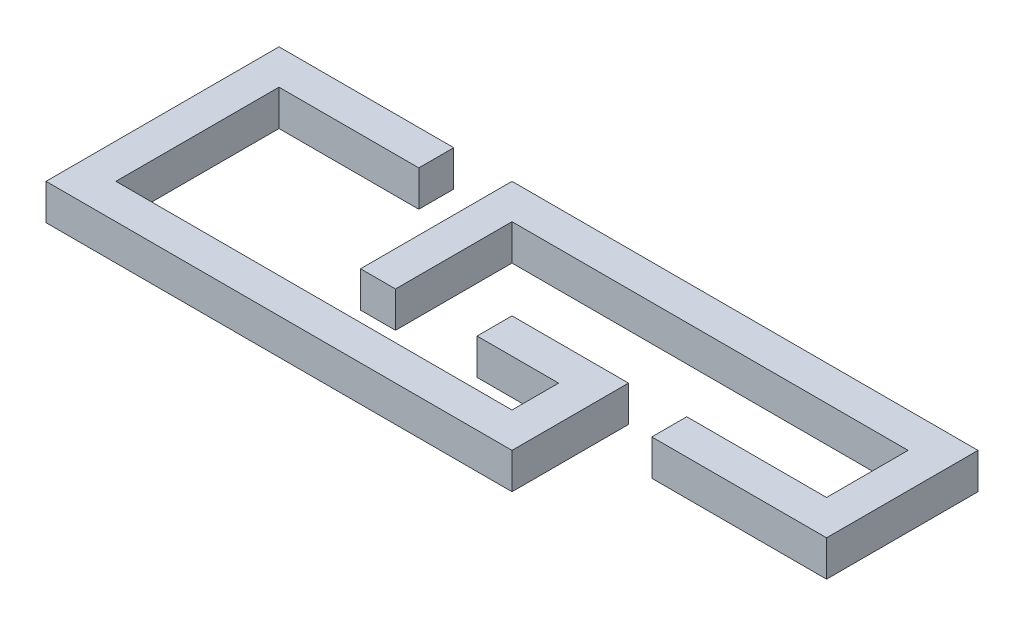
ISO-10303-21;
HEADER;
FILE_DESCRIPTION(('STEP AP214'),'2;1');
FILE_NAME('part.step','',(''),(''),'','','');
FILE_SCHEMA(('AUTOMOTIVE_DESIGN { 1 0 10303 214 1 1 1 1 }'));
ENDSEC;
DATA;
#1=APPLICATION_CONTEXT('core data for automotive mechanical design processes');
#2=APPLICATION_PROTOCOL_DEFINITION('international standard','automotive_design',2000,#1);
#3=PRODUCT_CONTEXT('',#1,'mechanical');
#4=PRODUCT('Part','Part','',(#3));
#5=PRODUCT_RELATED_PRODUCT_CATEGORY('part','',(#4));
#6=PRODUCT_DEFINITION_FORMATION('','',#4);
#7=PRODUCT_DEFINITION_CONTEXT('part definition',#1,'design');
#8=PRODUCT_DEFINITION('design','',#6,#7);
#9=PRODUCT_DEFINITION_SHAPE('','',#8);
#10=(LENGTH_UNIT() NAMED_UNIT(*) SI_UNIT(.MILLI.,.METRE.));
#11=(NAMED_UNIT(*) PLANE_ANGLE_UNIT() SI_UNIT($,.RADIAN.));
#12=(NAMED_UNIT(*) SI_UNIT($,.STERADIAN.) SOLID_ANGLE_UNIT());
#13=UNCERTAINTY_MEASURE_WITH_UNIT(LENGTH_MEASURE(1.E-05),#10,'distance_accuracy_value','');
#14=(GEOMETRIC_REPRESENTATION_CONTEXT(3) GLOBAL_UNCERTAINTY_ASSIGNED_CONTEXT((#13)) GLOBAL_UNIT_ASSIGNED_CONTEXT((#10,
#11,#12)) REPRESENTATION_CONTEXT('',''));
#15=CARTESIAN_POINT('',(0.,0.,0.));
#16=DIRECTION('',(0.,0.,1.));
#17=DIRECTION('',(1.,0.,0.));
#18=AXIS2_PLACEMENT_3D('',#15,#16,#17);
#19=CARTESIAN_POINT('',(-9.74999999999981,2.,-8.45000000000092));
#20=DIRECTION('',(0.,0.,1.));
#21=DIRECTION('',(1.,0.,0.));
#22=AXIS2_PLACEMENT_3D('',#19,#20,#21);
#23=PLANE('',#22);
#24=DIRECTION('',(-1.,0.,0.));
#25=VECTOR('',#24,1.);
#26=CARTESIAN_POINT('',(-9.74999999999981,0.,-8.45000000000092));
#27=LINE('',#26,#25);
#28=CARTESIAN_POINT('',(-9.74999999999981,0.,-8.45000000000092));
#29=VERTEX_POINT('',#28);
#30=CARTESIAN_POINT('',(-19.5000000000001,0.,-8.45000000000092));
#31=VERTEX_POINT('',#30);
#32=EDGE_CURVE('E163',#29,#31,#27,.T.);
#33=ORIENTED_EDGE('',*,*,#32,.T.);
#34=DIRECTION('',(0.,-1.,0.));
#35=VECTOR('',#34,1.);
#36=CARTESIAN_POINT('',(-19.5000000000001,2.,-8.45000000000092));
#37=LINE('',#36,#35);
#38=CARTESIAN_POINT('',(-19.5000000000001,2.,-8.45000000000092));
#39=VERTEX_POINT('',#38);
#40=EDGE_CURVE('E12',#39,#31,#37,.T.);
#41=ORIENTED_EDGE('',*,*,#40,.F.);
#42=DIRECTION('',(-1.,0.,0.));
#43=VECTOR('',#42,1.);
#44=CARTESIAN_POINT('',(-9.74999999999981,2.,-8.45000000000092));
#45=LINE('',#44,#43);
#46=CARTESIAN_POINT('',(-9.74999999999981,2.,-8.45000000000092));
#47=VERTEX_POINT('',#46);
#48=EDGE_CURVE('E185',#47,#39,#45,.T.);
#49=ORIENTED_EDGE('',*,*,#48,.F.);
#50=DIRECTION('',(0.,-1.,0.));
#51=VECTOR('',#50,1.);
#52=CARTESIAN_POINT('',(-9.74999999999981,2.,-8.45000000000092));
#53=LINE('',#52,#51);
#54=EDGE_CURVE('E159',#47,#29,#53,.T.);
#55=ORIENTED_EDGE('',*,*,#54,.T.);
#56=EDGE_LOOP('',(#33,#41,#49,#55));
#57=FACE_BOUND('',#56,.T.);
#58=ADVANCED_FACE('F43',(#57),#23,.F.);
#59=CARTESIAN_POINT('',(-19.5000000000001,2.,-8.45000000000092));
#60=DIRECTION('',(1.,0.,0.));
#61=DIRECTION('',(0.,0.,-1.));
#62=AXIS2_PLACEMENT_3D('',#59,#60,#61);
#63=PLANE('',#62);
#64=DIRECTION('',(0.,0.,1.));
#65=VECTOR('',#64,1.);
#66=CARTESIAN_POINT('',(-19.5000000000001,0.,-8.45000000000092));
#67=LINE('',#66,#65);
#68=CARTESIAN_POINT('',(-19.4999999999999,0.,4.55000000000027));
#69=VERTEX_POINT('',#68);
#70=EDGE_CURVE('E166',#31,#69,#67,.T.);
#71=ORIENTED_EDGE('',*,*,#70,.T.);
#72=DIRECTION('',(0.,-1.,0.));
#73=VECTOR('',#72,1.);
#74=CARTESIAN_POINT('',(-19.4999999999999,2.,4.55000000000027));
#75=LINE('',#74,#73);
#76=CARTESIAN_POINT('',(-19.4999999999999,2.,4.55000000000027));
#77=VERTEX_POINT('',#76);
#78=EDGE_CURVE('E51',#77,#69,#75,.T.);
#79=ORIENTED_EDGE('',*,*,#78,.F.);
#80=DIRECTION('',(0.,0.,1.));
#81=VECTOR('',#80,1.);
#82=CARTESIAN_POINT('',(-19.5000000000001,2.,-8.45000000000092));
#83=LINE('',#82,#81);
#84=EDGE_CURVE('E114',#39,#77,#83,.T.);
#85=ORIENTED_EDGE('',*,*,#84,.F.);
#86=ORIENTED_EDGE('',*,*,#40,.T.);
#87=EDGE_LOOP('',(#71,#79,#85,#86));
#88=FACE_BOUND('',#87,.T.);
#89=ADVANCED_FACE('F263',(#88),#63,.F.);
#90=CARTESIAN_POINT('',(-19.4999999999999,2.,4.55000000000027));
#91=DIRECTION('',(0.,0.,-1.));
#92=DIRECTION('',(-1.,0.,0.));
#93=AXIS2_PLACEMENT_3D('',#90,#91,#92);
#94=PLANE('',#93);
#95=DIRECTION('',(1.,0.,0.));
#96=VECTOR('',#95,1.);
#97=CARTESIAN_POINT('',(-19.4999999999999,0.,4.55000000000027));
#98=LINE('',#97,#96);
#99=CARTESIAN_POINT('',(6.50000000000007,0.,4.55000000000027));
#100=VERTEX_POINT('',#99);
#101=EDGE_CURVE('E168',#69,#100,#98,.T.);
#102=ORIENTED_EDGE('',*,*,#101,.T.);
#103=DIRECTION('',(0.,-1.,0.));
#104=VECTOR('',#103,1.);
#105=CARTESIAN_POINT('',(6.50000000000007,2.,4.55000000000027));
#106=LINE('',#105,#104);
#107=CARTESIAN_POINT('',(6.50000000000007,2.,4.55000000000027));
#108=VERTEX_POINT('',#107);
#109=EDGE_CURVE('E204',#108,#100,#106,.T.);
#110=ORIENTED_EDGE('',*,*,#109,.F.);
#111=DIRECTION('',(1.,0.,0.));
#112=VECTOR('',#111,1.);
#113=CARTESIAN_POINT('',(-19.4999999999999,2.,4.55000000000027));
#114=LINE('',#113,#112);
#115=EDGE_CURVE('E212',#77,#108,#114,.T.);
#116=ORIENTED_EDGE('',*,*,#115,.F.);
#117=ORIENTED_EDGE('',*,*,#78,.T.);
#118=EDGE_LOOP('',(#102,#110,#116,#117));
#119=FACE_BOUND('',#118,.T.);
#120=ADVANCED_FACE('F210',(#119),#94,.F.);
#121=CARTESIAN_POINT('',(6.50000000000007,2.,4.55000000000027));
#122=DIRECTION('',(-1.,0.,0.));
#123=DIRECTION('',(0.,0.,1.));
#124=AXIS2_PLACEMENT_3D('',#121,#122,#123);
#125=PLANE('',#124);
#126=DIRECTION('',(0.,0.,-1.));
#127=VECTOR('',#126,1.);
#128=CARTESIAN_POINT('',(6.50000000000007,0.,4.55000000000027));
#129=LINE('',#128,#127);
#130=CARTESIAN_POINT('',(6.50000000000007,0.,-1.94999999999952));
#131=VERTEX_POINT('',#130);
#132=EDGE_CURVE('E170',#100,#131,#129,.T.);
#133=ORIENTED_EDGE('',*,*,#132,.T.);
#134=DIRECTION('',(0.,-1.,0.));
#135=VECTOR('',#134,1.);
#136=CARTESIAN_POINT('',(6.50000000000007,2.,-1.94999999999952));
#137=LINE('',#136,#135);
#138=CARTESIAN_POINT('',(6.50000000000007,2.,-1.94999999999952));
#139=VERTEX_POINT('',#138);
#140=EDGE_CURVE('E201',#139,#131,#137,.T.);
#141=ORIENTED_EDGE('',*,*,#140,.F.);
#142=DIRECTION('',(0.,0.,-1.));
#143=VECTOR('',#142,1.);
#144=CARTESIAN_POINT('',(6.50000000000007,2.,4.55000000000027));
#145=LINE('',#144,#143);
#146=EDGE_CURVE('E230',#108,#139,#145,.T.);
#147=ORIENTED_EDGE('',*,*,#146,.F.);
#148=ORIENTED_EDGE('',*,*,#109,.T.);
#149=EDGE_LOOP('',(#133,#141,#147,#148));
#150=FACE_BOUND('',#149,.T.);
#151=ADVANCED_FACE('F221',(#150),#125,.F.);
#152=CARTESIAN_POINT('',(6.50000000000007,2.,-1.94999999999952));
#153=DIRECTION('',(0.,0.,1.));
#154=DIRECTION('',(1.,0.,0.));
#155=AXIS2_PLACEMENT_3D('',#152,#153,#154);
#156=PLANE('',#155);
#157=DIRECTION('',(-1.,0.,0.));
#158=VECTOR('',#157,1.);
#159=CARTESIAN_POINT('',(6.50000000000007,0.,-1.94999999999952));
#160=LINE('',#159,#158);
#161=CARTESIAN_POINT('',(0.,0.,-1.94999999999952));
#162=VERTEX_POINT('',#161);
#163=EDGE_CURVE('E172',#131,#162,#160,.T.);
#164=ORIENTED_EDGE('',*,*,#163,.T.);
#165=DIRECTION('',(0.,-1.,0.));
#166=VECTOR('',#165,1.);
#167=CARTESIAN_POINT('',(0.,2.,-1.94999999999952));
#168=LINE('',#167,#166);
#169=CARTESIAN_POINT('',(0.,2.,-1.94999999999952));
#170=VERTEX_POINT('',#169);
#171=EDGE_CURVE('E198',#170,#162,#168,.T.);
#172=ORIENTED_EDGE('',*,*,#171,.F.);
#173=DIRECTION('',(-1.,0.,0.));
#174=VECTOR('',#173,1.);
#175=CARTESIAN_POINT('',(6.50000000000007,2.,-1.94999999999952));
#176=LINE('',#175,#174);
#177=EDGE_CURVE('E227',#139,#170,#176,.T.);
#178=ORIENTED_EDGE('',*,*,#177,.F.);
#179=ORIENTED_EDGE('',*,*,#140,.T.);
#180=EDGE_LOOP('',(#164,#172,#178,#179));
#181=FACE_BOUND('',#180,.T.);
#182=ADVANCED_FACE('F225',(#181),#156,.F.);
#183=CARTESIAN_POINT('',(0.,2.,-1.94999999999952));
#184=DIRECTION('',(1.,0.,0.));
#185=DIRECTION('',(0.,0.,-1.));
#186=AXIS2_PLACEMENT_3D('',#183,#184,#185);
#187=PLANE('',#186);
#188=DIRECTION('',(0.,0.,1.));
#189=VECTOR('',#188,1.);
#190=CARTESIAN_POINT('',(0.,0.,-1.94999999999952));
#191=LINE('',#190,#189);
#192=CARTESIAN_POINT('',(0.,0.,0.));
#193=VERTEX_POINT('',#192);
#194=EDGE_CURVE('E174',#162,#193,#191,.T.);
#195=ORIENTED_EDGE('',*,*,#194,.T.);
#196=DIRECTION('',(0.,-1.,0.));
#197=VECTOR('',#196,1.);
#198=CARTESIAN_POINT('',(0.,2.,0.));
#199=LINE('',#198,#197);
#200=CARTESIAN_POINT('',(0.,2.,0.));
#201=VERTEX_POINT('',#200);
#202=EDGE_CURVE('E195',#201,#193,#199,.T.);
#203=ORIENTED_EDGE('',*,*,#202,.F.);
#204=DIRECTION('',(0.,0.,1.));
#205=VECTOR('',#204,1.);
#206=CARTESIAN_POINT('',(0.,2.,-1.94999999999952));
#207=LINE('',#206,#205);
#208=EDGE_CURVE('E229',#170,#201,#207,.T.);
#209=ORIENTED_EDGE('',*,*,#208,.F.);
#210=ORIENTED_EDGE('',*,*,#171,.T.);
#211=EDGE_LOOP('',(#195,#203,#209,#210));
#212=FACE_BOUND('',#211,.T.);
#213=ADVANCED_FACE('F276',(#212),#187,.F.);
#214=CARTESIAN_POINT('',(0.,2.,0.));
#215=DIRECTION('',(0.,0.,-1.));
#216=DIRECTION('',(-1.,0.,0.));
#217=AXIS2_PLACEMENT_3D('',#214,#215,#216);
#218=PLANE('',#217);
#219=DIRECTION('',(1.,0.,0.));
#220=VECTOR('',#219,1.);
#221=CARTESIAN_POINT('',(0.,0.,0.));
#222=LINE('',#221,#220);
#223=CARTESIAN_POINT('',(4.55000000000004,0.,2.40579105544886E-13));
#224=VERTEX_POINT('',#223);
#225=EDGE_CURVE('E176',#193,#224,#222,.T.);
#226=ORIENTED_EDGE('',*,*,#225,.T.);
#227=DIRECTION('',(0.,-1.,0.));
#228=VECTOR('',#227,1.);
#229=CARTESIAN_POINT('',(4.55000000000004,2.,2.40579105544886E-13));
#230=LINE('',#229,#228);
#231=CARTESIAN_POINT('',(4.55000000000004,2.,2.40579105544886E-13));
#232=VERTEX_POINT('',#231);
#233=EDGE_CURVE('E192',#232,#224,#230,.T.);
#234=ORIENTED_EDGE('',*,*,#233,.F.);
#235=DIRECTION('',(1.,0.,0.));
#236=VECTOR('',#235,1.);
#237=CARTESIAN_POINT('',(0.,2.,0.));
#238=LINE('',#237,#236);
#239=EDGE_CURVE('E232',#201,#232,#238,.T.);
#240=ORIENTED_EDGE('',*,*,#239,.F.);
#241=ORIENTED_EDGE('',*,*,#202,.T.);
#242=EDGE_LOOP('',(#226,#234,#240,#241));
#243=FACE_BOUND('',#242,.T.);
#244=ADVANCED_FACE('F279',(#243),#218,.F.);
#245=CARTESIAN_POINT('',(4.55000000000004,2.,2.40579105544886E-13));
#246=DIRECTION('',(1.,0.,0.));
#247=DIRECTION('',(0.,0.,-1.));
#248=AXIS2_PLACEMENT_3D('',#245,#246,#247);
#249=PLANE('',#248);
#250=DIRECTION('',(0.,0.,1.));
#251=VECTOR('',#250,1.);
#252=CARTESIAN_POINT('',(4.55000000000004,0.,2.40579105544886E-13));
#253=LINE('',#252,#251);
#254=CARTESIAN_POINT('',(4.55000000000004,0.,2.60000000000024));
#255=VERTEX_POINT('',#254);
#256=EDGE_CURVE('E178',#224,#255,#253,.T.);
#257=ORIENTED_EDGE('',*,*,#256,.T.);
#258=DIRECTION('',(0.,-1.,0.));
#259=VECTOR('',#258,1.);
#260=CARTESIAN_POINT('',(4.55000000000004,2.,2.60000000000024));
#261=LINE('',#260,#259);
#262=CARTESIAN_POINT('',(4.55000000000004,2.,2.60000000000024));
#263=VERTEX_POINT('',#262);
#264=EDGE_CURVE('E189',#263,#255,#261,.T.);
#265=ORIENTED_EDGE('',*,*,#264,.F.);
#266=DIRECTION('',(0.,0.,1.));
#267=VECTOR('',#266,1.);
#268=CARTESIAN_POINT('',(4.55000000000004,2.,2.40579105544886E-13));
#269=LINE('',#268,#267);
#270=EDGE_CURVE('E238',#232,#263,#269,.T.);
#271=ORIENTED_EDGE('',*,*,#270,.F.);
#272=ORIENTED_EDGE('',*,*,#233,.T.);
#273=EDGE_LOOP('',(#257,#265,#271,#272));
#274=FACE_BOUND('',#273,.T.);
#275=ADVANCED_FACE('F244',(#274),#249,.F.);
#276=CARTESIAN_POINT('',(4.55000000000004,2.,2.60000000000024));
#277=DIRECTION('',(0.,0.,1.));
#278=DIRECTION('',(1.,0.,0.));
#279=AXIS2_PLACEMENT_3D('',#276,#277,#278);
#280=PLANE('',#279);
#281=DIRECTION('',(-1.,0.,0.));
#282=VECTOR('',#281,1.);
#283=CARTESIAN_POINT('',(4.55000000000004,0.,2.60000000000024));
#284=LINE('',#283,#282);
#285=CARTESIAN_POINT('',(-17.55,0.,2.60000000000024));
#286=VERTEX_POINT('',#285);
#287=EDGE_CURVE('E180',#255,#286,#284,.T.);
#288=ORIENTED_EDGE('',*,*,#287,.T.);
#289=DIRECTION('',(0.,-1.,0.));
#290=VECTOR('',#289,1.);
#291=CARTESIAN_POINT('',(-17.55,2.,2.60000000000024));
#292=LINE('',#291,#290);
#293=CARTESIAN_POINT('',(-17.55,2.,2.60000000000024));
#294=VERTEX_POINT('',#293);
#295=EDGE_CURVE('E154',#294,#286,#292,.T.);
#296=ORIENTED_EDGE('',*,*,#295,.F.);
#297=DIRECTION('',(-1.,0.,0.));
#298=VECTOR('',#297,1.);
#299=CARTESIAN_POINT('',(4.55000000000004,2.,2.60000000000024));
#300=LINE('',#299,#298);
#301=EDGE_CURVE('E145',#263,#294,#300,.T.);
#302=ORIENTED_EDGE('',*,*,#301,.F.);
#303=ORIENTED_EDGE('',*,*,#264,.T.);
#304=EDGE_LOOP('',(#288,#296,#302,#303));
#305=FACE_BOUND('',#304,.T.);
#306=ADVANCED_FACE('F248',(#305),#280,.F.);
#307=CARTESIAN_POINT('',(-17.55,2.,2.60000000000024));
#308=DIRECTION('',(-1.,0.,0.));
#309=DIRECTION('',(0.,0.,1.));
#310=AXIS2_PLACEMENT_3D('',#307,#308,#309);
#311=PLANE('',#310);
#312=DIRECTION('',(0.,0.,-1.));
#313=VECTOR('',#312,1.);
#314=CARTESIAN_POINT('',(-17.55,0.,2.60000000000024));
#315=LINE('',#314,#313);
#316=CARTESIAN_POINT('',(-17.55,0.,-6.50000000000068));
#317=VERTEX_POINT('',#316);
#318=EDGE_CURVE('E153',#286,#317,#315,.T.);
#319=ORIENTED_EDGE('',*,*,#318,.T.);
#320=DIRECTION('',(0.,-1.,0.));
#321=VECTOR('',#320,1.);
#322=CARTESIAN_POINT('',(-17.55,2.,-6.50000000000068));
#323=LINE('',#322,#321);
#324=CARTESIAN_POINT('',(-17.55,2.,-6.50000000000068));
#325=VERTEX_POINT('',#324);
#326=EDGE_CURVE('E150',#325,#317,#323,.T.);
#327=ORIENTED_EDGE('',*,*,#326,.F.);
#328=DIRECTION('',(0.,0.,-1.));
#329=VECTOR('',#328,1.);
#330=CARTESIAN_POINT('',(-17.55,2.,2.60000000000024));
#331=LINE('',#330,#329);
#332=EDGE_CURVE('E139',#294,#325,#331,.T.);
#333=ORIENTED_EDGE('',*,*,#332,.F.);
#334=ORIENTED_EDGE('',*,*,#295,.T.);
#335=EDGE_LOOP('',(#319,#327,#333,#334));
#336=FACE_BOUND('',#335,.T.);
#337=ADVANCED_FACE('F151',(#336),#311,.F.);
#338=CARTESIAN_POINT('',(-17.55,2.,-6.50000000000068));
#339=DIRECTION('',(0.,0.,-1.));
#340=DIRECTION('',(-1.,0.,0.));
#341=AXIS2_PLACEMENT_3D('',#338,#339,#340);
#342=PLANE('',#341);
#343=DIRECTION('',(1.,0.,0.));
#344=VECTOR('',#343,1.);
#345=CARTESIAN_POINT('',(-17.55,0.,-6.50000000000068));
#346=LINE('',#345,#344);
#347=CARTESIAN_POINT('',(-9.74999999999981,0.,-6.5000000000006));
#348=VERTEX_POINT('',#347);
#349=EDGE_CURVE('E100',#317,#348,#346,.T.);
#350=ORIENTED_EDGE('',*,*,#349,.T.);
#351=DIRECTION('',(0.,-1.,0.));
#352=VECTOR('',#351,1.);
#353=CARTESIAN_POINT('',(-9.74999999999981,2.,-6.5000000000006));
#354=LINE('',#353,#352);
#355=CARTESIAN_POINT('',(-9.74999999999981,2.,-6.5000000000006));
#356=VERTEX_POINT('',#355);
#357=EDGE_CURVE('E155',#356,#348,#354,.T.);
#358=ORIENTED_EDGE('',*,*,#357,.F.);
#359=DIRECTION('',(1.,0.,0.));
#360=VECTOR('',#359,1.);
#361=CARTESIAN_POINT('',(-17.55,2.,-6.50000000000068));
#362=LINE('',#361,#360);
#363=EDGE_CURVE('E143',#325,#356,#362,.T.);
#364=ORIENTED_EDGE('',*,*,#363,.F.);
#365=ORIENTED_EDGE('',*,*,#326,.T.);
#366=EDGE_LOOP('',(#350,#358,#364,#365));
#367=FACE_BOUND('',#366,.T.);
#368=ADVANCED_FACE('F157',(#367),#342,.F.);
#369=CARTESIAN_POINT('',(-9.74999999999981,2.,-6.5000000000006));
#370=DIRECTION('',(-1.,0.,0.));
#371=DIRECTION('',(0.,0.,1.));
#372=AXIS2_PLACEMENT_3D('',#369,#370,#371);
#373=PLANE('',#372);
#374=DIRECTION('',(0.,0.,-1.));
#375=VECTOR('',#374,1.);
#376=CARTESIAN_POINT('',(-9.74999999999981,0.,-6.5000000000006));
#377=LINE('',#376,#375);
#378=EDGE_CURVE('E106',#348,#29,#377,.T.);
#379=ORIENTED_EDGE('',*,*,#378,.T.);
#380=ORIENTED_EDGE('',*,*,#54,.F.);
#381=DIRECTION('',(0.,0.,-1.));
#382=VECTOR('',#381,1.);
#383=CARTESIAN_POINT('',(-9.74999999999981,2.,-6.5000000000006));
#384=LINE('',#383,#382);
#385=EDGE_CURVE('E59',#356,#47,#384,.T.);
#386=ORIENTED_EDGE('',*,*,#385,.F.);
#387=ORIENTED_EDGE('',*,*,#357,.T.);
#388=EDGE_LOOP('',(#379,#380,#386,#387));
#389=FACE_BOUND('',#388,.T.);
#390=ADVANCED_FACE('F252',(#389),#373,.F.);
#391=CARTESIAN_POINT('',(0.,2.,0.));
#392=DIRECTION('',(0.,1.,0.));
#393=DIRECTION('',(0.,0.,1.));
#394=AXIS2_PLACEMENT_3D('',#391,#392,#393);
#395=PLANE('',#394);
#396=ORIENTED_EDGE('',*,*,#48,.T.);
#397=ORIENTED_EDGE('',*,*,#84,.T.);
#398=ORIENTED_EDGE('',*,*,#115,.T.);
#399=ORIENTED_EDGE('',*,*,#146,.T.);
#400=ORIENTED_EDGE('',*,*,#177,.T.);
#401=ORIENTED_EDGE('',*,*,#208,.T.);
#402=ORIENTED_EDGE('',*,*,#239,.T.);
#403=ORIENTED_EDGE('',*,*,#270,.T.);
#404=ORIENTED_EDGE('',*,*,#301,.T.);
#405=ORIENTED_EDGE('',*,*,#332,.T.);
#406=ORIENTED_EDGE('',*,*,#363,.T.);
#407=ORIENTED_EDGE('',*,*,#385,.T.);
#408=EDGE_LOOP('',(#396,#397,#398,#399,#400,#401,#402,#403,#404,#405,#406,#407));
#409=FACE_BOUND('',#408,.T.);
#410=ADVANCED_FACE('F141',(#409),#395,.T.);
#411=CARTESIAN_POINT('',(0.,0.,0.));
#412=DIRECTION('',(0.,1.,0.));
#413=DIRECTION('',(0.,0.,1.));
#414=AXIS2_PLACEMENT_3D('',#411,#412,#413);
#415=PLANE('',#414);
#416=ORIENTED_EDGE('',*,*,#32,.F.);
#417=ORIENTED_EDGE('',*,*,#378,.F.);
#418=ORIENTED_EDGE('',*,*,#349,.F.);
#419=ORIENTED_EDGE('',*,*,#318,.F.);
#420=ORIENTED_EDGE('',*,*,#287,.F.);
#421=ORIENTED_EDGE('',*,*,#256,.F.);
#422=ORIENTED_EDGE('',*,*,#225,.F.);
#423=ORIENTED_EDGE('',*,*,#194,.F.);
#424=ORIENTED_EDGE('',*,*,#163,.F.);
#425=ORIENTED_EDGE('',*,*,#132,.F.);
#426=ORIENTED_EDGE('',*,*,#101,.F.);
#427=ORIENTED_EDGE('',*,*,#70,.F.);
#428=EDGE_LOOP('',(#416,#417,#418,#419,#420,#421,#422,#423,#424,#425,#426,#427));
#429=FACE_BOUND('',#428,.T.);
#430=ADVANCED_FACE('F216',(#429),#415,.F.);
#431=CLOSED_SHELL('',(#58,#89,#120,#151,#182,#213,#244,#275,#306,#337,#368,#390,#410,#430));
#432=MANIFOLD_SOLID_BREP('B2',#431);
#433=CARTESIAN_POINT('',(19.5,2.,-8.44999999999991));
#434=DIRECTION('',(0.,0.,1.));
#435=DIRECTION('',(1.,0.,0.));
#436=AXIS2_PLACEMENT_3D('',#433,#434,#435);
#437=PLANE('',#436);
#438=DIRECTION('',(-1.,0.,0.));
#439=VECTOR('',#438,1.);
#440=CARTESIAN_POINT('',(19.5,0.,-8.44999999999991));
#441=LINE('',#440,#439);
#442=CARTESIAN_POINT('',(19.5,0.,-8.44999999999991));
#443=VERTEX_POINT('',#442);
#444=CARTESIAN_POINT('',(-6.50000000000012,0.,-8.44999999999991));
#445=VERTEX_POINT('',#444);
#446=EDGE_CURVE('E483',#443,#445,#441,.T.);
#447=ORIENTED_EDGE('',*,*,#446,.T.);
#448=DIRECTION('',(0.,-1.,0.));
#449=VECTOR('',#448,1.);
#450=CARTESIAN_POINT('',(-6.50000000000012,2.,-8.44999999999991));
#451=LINE('',#450,#449);
#452=CARTESIAN_POINT('',(-6.50000000000012,2.,-8.44999999999991));
#453=VERTEX_POINT('',#452);
#454=EDGE_CURVE('E41',#453,#445,#451,.T.);
#455=ORIENTED_EDGE('',*,*,#454,.F.);
#456=DIRECTION('',(-1.,0.,0.));
#457=VECTOR('',#456,1.);
#458=CARTESIAN_POINT('',(19.5,2.,-8.44999999999991));
#459=LINE('',#458,#457);
#460=CARTESIAN_POINT('',(19.5,2.,-8.44999999999991));
#461=VERTEX_POINT('',#460);
#462=EDGE_CURVE('E501',#461,#453,#459,.T.);
#463=ORIENTED_EDGE('',*,*,#462,.F.);
#464=DIRECTION('',(0.,-1.,0.));
#465=VECTOR('',#464,1.);
#466=CARTESIAN_POINT('',(19.5,2.,-8.44999999999991));
#467=LINE('',#466,#465);
#468=EDGE_CURVE('E479',#461,#443,#467,.T.);
#469=ORIENTED_EDGE('',*,*,#468,.T.);
#470=EDGE_LOOP('',(#447,#455,#463,#469));
#471=FACE_BOUND('',#470,.T.);
#472=ADVANCED_FACE('F375',(#471),#437,.F.);
#473=CARTESIAN_POINT('',(-6.50000000000012,2.,-8.44999999999991));
#474=DIRECTION('',(1.,0.,0.));
#475=DIRECTION('',(0.,0.,-1.));
#476=AXIS2_PLACEMENT_3D('',#473,#474,#475);
#477=PLANE('',#476);
#478=DIRECTION('',(0.,0.,1.));
#479=VECTOR('',#478,1.);
#480=CARTESIAN_POINT('',(-6.50000000000012,0.,-8.44999999999991));
#481=LINE('',#480,#479);
#482=CARTESIAN_POINT('',(-6.50000000000006,0.,-1.14810049406708E-12));
#483=VERTEX_POINT('',#482);
#484=EDGE_CURVE('E486',#445,#483,#481,.T.);
#485=ORIENTED_EDGE('',*,*,#484,.T.);
#486=DIRECTION('',(0.,-1.,0.));
#487=VECTOR('',#486,1.);
#488=CARTESIAN_POINT('',(-6.50000000000006,2.,-1.14810049406708E-12));
#489=LINE('',#488,#487);
#490=CARTESIAN_POINT('',(-6.50000000000006,2.,-1.14810049406708E-12));
#491=VERTEX_POINT('',#490);
#492=EDGE_CURVE('E383',#491,#483,#489,.T.);
#493=ORIENTED_EDGE('',*,*,#492,.F.);
#494=DIRECTION('',(0.,0.,1.));
#495=VECTOR('',#494,1.);
#496=CARTESIAN_POINT('',(-6.50000000000012,2.,-8.44999999999991));
#497=LINE('',#496,#495);
#498=EDGE_CURVE('E440',#453,#491,#497,.T.);
#499=ORIENTED_EDGE('',*,*,#498,.F.);
#500=ORIENTED_EDGE('',*,*,#454,.T.);
#501=EDGE_LOOP('',(#485,#493,#499,#500));
#502=FACE_BOUND('',#501,.T.);
#503=ADVANCED_FACE('F550',(#502),#477,.F.);
#504=CARTESIAN_POINT('',(-6.50000000000006,2.,-1.14810049406708E-12));
#505=DIRECTION('',(0.,0.,-1.));
#506=DIRECTION('',(-1.,0.,0.));
#507=AXIS2_PLACEMENT_3D('',#504,#505,#506);
#508=PLANE('',#507);
#509=DIRECTION('',(1.,0.,0.));
#510=VECTOR('',#509,1.);
#511=CARTESIAN_POINT('',(-6.50000000000006,0.,-1.14810049406708E-12));
#512=LINE('',#511,#510);
#513=CARTESIAN_POINT('',(-4.55000000000005,0.,-1.16171727128857E-12));
#514=VERTEX_POINT('',#513);
#515=EDGE_CURVE('E488',#483,#514,#512,.T.);
#516=ORIENTED_EDGE('',*,*,#515,.T.);
#517=DIRECTION('',(0.,-1.,0.));
#518=VECTOR('',#517,1.);
#519=CARTESIAN_POINT('',(-4.55000000000005,2.,-1.16171727128857E-12));
#520=LINE('',#519,#518);
#521=CARTESIAN_POINT('',(-4.55000000000005,2.,-1.16171727128857E-12));
#522=VERTEX_POINT('',#521);
#523=EDGE_CURVE('E514',#522,#514,#520,.T.);
#524=ORIENTED_EDGE('',*,*,#523,.F.);
#525=DIRECTION('',(1.,0.,0.));
#526=VECTOR('',#525,1.);
#527=CARTESIAN_POINT('',(-6.50000000000006,2.,-1.14810049406708E-12));
#528=LINE('',#527,#526);
#529=EDGE_CURVE('E522',#491,#522,#528,.T.);
#530=ORIENTED_EDGE('',*,*,#529,.F.);
#531=ORIENTED_EDGE('',*,*,#492,.T.);
#532=EDGE_LOOP('',(#516,#524,#530,#531));
#533=FACE_BOUND('',#532,.T.);
#534=ADVANCED_FACE('F520',(#533),#508,.F.);
#535=CARTESIAN_POINT('',(-4.55000000000005,2.,-1.16171727128857E-12));
#536=DIRECTION('',(-1.,0.,0.));
#537=DIRECTION('',(0.,0.,1.));
#538=AXIS2_PLACEMENT_3D('',#535,#536,#537);
#539=PLANE('',#538);
#540=DIRECTION('',(0.,0.,-1.));
#541=VECTOR('',#540,1.);
#542=CARTESIAN_POINT('',(-4.55000000000005,0.,-1.16171727128857E-12));
#543=LINE('',#542,#541);
#544=CARTESIAN_POINT('',(-4.55000000000009,0.,-6.49999999999994));
#545=VERTEX_POINT('',#544);
#546=EDGE_CURVE('E490',#514,#545,#543,.T.);
#547=ORIENTED_EDGE('',*,*,#546,.T.);
#548=DIRECTION('',(0.,-1.,0.));
#549=VECTOR('',#548,1.);
#550=CARTESIAN_POINT('',(-4.55000000000009,2.,-6.49999999999994));
#551=LINE('',#550,#549);
#552=CARTESIAN_POINT('',(-4.55000000000009,2.,-6.49999999999994));
#553=VERTEX_POINT('',#552);
#554=EDGE_CURVE('E511',#553,#545,#551,.T.);
#555=ORIENTED_EDGE('',*,*,#554,.F.);
#556=DIRECTION('',(0.,0.,-1.));
#557=VECTOR('',#556,1.);
#558=CARTESIAN_POINT('',(-4.55000000000005,2.,-1.16171727128857E-12));
#559=LINE('',#558,#557);
#560=EDGE_CURVE('E540',#522,#553,#559,.T.);
#561=ORIENTED_EDGE('',*,*,#560,.F.);
#562=ORIENTED_EDGE('',*,*,#523,.T.);
#563=EDGE_LOOP('',(#547,#555,#561,#562));
#564=FACE_BOUND('',#563,.T.);
#565=ADVANCED_FACE('F531',(#564),#539,.F.);
#566=CARTESIAN_POINT('',(-4.55000000000009,2.,-6.49999999999994));
#567=DIRECTION('',(0.,0.,-1.));
#568=DIRECTION('',(-1.,0.,0.));
#569=AXIS2_PLACEMENT_3D('',#566,#567,#568);
#570=PLANE('',#569);
#571=DIRECTION('',(1.,0.,0.));
#572=VECTOR('',#571,1.);
#573=CARTESIAN_POINT('',(-4.55000000000009,0.,-6.49999999999994));
#574=LINE('',#573,#572);
#575=CARTESIAN_POINT('',(17.5499999999999,0.,-6.49999999999994));
#576=VERTEX_POINT('',#575);
#577=EDGE_CURVE('E492',#545,#576,#574,.T.);
#578=ORIENTED_EDGE('',*,*,#577,.T.);
#579=DIRECTION('',(0.,-1.,0.));
#580=VECTOR('',#579,1.);
#581=CARTESIAN_POINT('',(17.5499999999999,2.,-6.49999999999994));
#582=LINE('',#581,#580);
#583=CARTESIAN_POINT('',(17.5499999999999,2.,-6.49999999999994));
#584=VERTEX_POINT('',#583);
#585=EDGE_CURVE('E508',#584,#576,#582,.T.);
#586=ORIENTED_EDGE('',*,*,#585,.F.);
#587=DIRECTION('',(1.,0.,0.));
#588=VECTOR('',#587,1.);
#589=CARTESIAN_POINT('',(-4.55000000000009,2.,-6.49999999999994));
#590=LINE('',#589,#588);
#591=EDGE_CURVE('E537',#553,#584,#590,.T.);
#592=ORIENTED_EDGE('',*,*,#591,.F.);
#593=ORIENTED_EDGE('',*,*,#554,.T.);
#594=EDGE_LOOP('',(#578,#586,#592,#593));
#595=FACE_BOUND('',#594,.T.);
#596=ADVANCED_FACE('F535',(#595),#570,.F.);
#597=CARTESIAN_POINT('',(17.5499999999999,2.,-6.49999999999994));
#598=DIRECTION('',(1.,0.,0.));
#599=DIRECTION('',(0.,0.,-1.));
#600=AXIS2_PLACEMENT_3D('',#597,#598,#599);
#601=PLANE('',#600);
#602=DIRECTION('',(0.,0.,1.));
#603=VECTOR('',#602,1.);
#604=CARTESIAN_POINT('',(17.5499999999999,0.,-6.49999999999994));
#605=LINE('',#604,#603);
#606=CARTESIAN_POINT('',(17.5499999999999,0.,-1.94999999999994));
#607=VERTEX_POINT('',#606);
#608=EDGE_CURVE('E494',#576,#607,#605,.T.);
#609=ORIENTED_EDGE('',*,*,#608,.T.);
#610=DIRECTION('',(0.,-1.,0.));
#611=VECTOR('',#610,1.);
#612=CARTESIAN_POINT('',(17.5499999999999,2.,-1.94999999999994));
#613=LINE('',#612,#611);
#614=CARTESIAN_POINT('',(17.5499999999999,2.,-1.94999999999994));
#615=VERTEX_POINT('',#614);
#616=EDGE_CURVE('E505',#615,#607,#613,.T.);
#617=ORIENTED_EDGE('',*,*,#616,.F.);
#618=DIRECTION('',(0.,0.,1.));
#619=VECTOR('',#618,1.);
#620=CARTESIAN_POINT('',(17.5499999999999,2.,-6.49999999999994));
#621=LINE('',#620,#619);
#622=EDGE_CURVE('E539',#584,#615,#621,.T.);
#623=ORIENTED_EDGE('',*,*,#622,.F.);
#624=ORIENTED_EDGE('',*,*,#585,.T.);
#625=EDGE_LOOP('',(#609,#617,#623,#624));
#626=FACE_BOUND('',#625,.T.);
#627=ADVANCED_FACE('F562',(#626),#601,.F.);
#628=CARTESIAN_POINT('',(17.5499999999999,2.,-1.94999999999994));
#629=DIRECTION('',(0.,0.,1.));
#630=DIRECTION('',(1.,0.,0.));
#631=AXIS2_PLACEMENT_3D('',#628,#629,#630);
#632=PLANE('',#631);
#633=DIRECTION('',(-1.,0.,0.));
#634=VECTOR('',#633,1.);
#635=CARTESIAN_POINT('',(17.5499999999999,0.,-1.94999999999994));
#636=LINE('',#635,#634);
#637=CARTESIAN_POINT('',(9.74999999999997,0.,-1.95000000000014));
#638=VERTEX_POINT('',#637);
#639=EDGE_CURVE('E496',#607,#638,#636,.T.);
#640=ORIENTED_EDGE('',*,*,#639,.T.);
#641=DIRECTION('',(0.,-1.,0.));
#642=VECTOR('',#641,1.);
#643=CARTESIAN_POINT('',(9.74999999999997,2.,-1.95000000000014));
#644=LINE('',#643,#642);
#645=CARTESIAN_POINT('',(9.74999999999997,2.,-1.95000000000014));
#646=VERTEX_POINT('',#645);
#647=EDGE_CURVE('E474',#646,#638,#644,.T.);
#648=ORIENTED_EDGE('',*,*,#647,.F.);
#649=DIRECTION('',(-1.,0.,0.));
#650=VECTOR('',#649,1.);
#651=CARTESIAN_POINT('',(17.5499999999999,2.,-1.94999999999994));
#652=LINE('',#651,#650);
#653=EDGE_CURVE('E465',#615,#646,#652,.T.);
#654=ORIENTED_EDGE('',*,*,#653,.F.);
#655=ORIENTED_EDGE('',*,*,#616,.T.);
#656=EDGE_LOOP('',(#640,#648,#654,#655));
#657=FACE_BOUND('',#656,.T.);
#658=ADVANCED_FACE('F565',(#657),#632,.F.);
#659=CARTESIAN_POINT('',(9.74999999999997,2.,-1.95000000000014));
#660=DIRECTION('',(1.,0.,0.));
#661=DIRECTION('',(0.,0.,-1.));
#662=AXIS2_PLACEMENT_3D('',#659,#660,#661);
#663=PLANE('',#662);
#664=DIRECTION('',(0.,0.,1.));
#665=VECTOR('',#664,1.);
#666=CARTESIAN_POINT('',(9.74999999999997,0.,-1.95000000000014));
#667=LINE('',#666,#665);
#668=CARTESIAN_POINT('',(9.74999999999997,0.,2.56743084769216E-13));
#669=VERTEX_POINT('',#668);
#670=EDGE_CURVE('E473',#638,#669,#667,.T.);
#671=ORIENTED_EDGE('',*,*,#670,.T.);
#672=DIRECTION('',(0.,-1.,0.));
#673=VECTOR('',#672,1.);
#674=CARTESIAN_POINT('',(9.74999999999997,2.,2.56743084769216E-13));
#675=LINE('',#674,#673);
#676=CARTESIAN_POINT('',(9.74999999999997,2.,2.56743084769216E-13));
#677=VERTEX_POINT('',#676);
#678=EDGE_CURVE('E470',#677,#669,#675,.T.);
#679=ORIENTED_EDGE('',*,*,#678,.F.);
#680=DIRECTION('',(0.,0.,1.));
#681=VECTOR('',#680,1.);
#682=CARTESIAN_POINT('',(9.74999999999997,2.,-1.95000000000014));
#683=LINE('',#682,#681);
#684=EDGE_CURVE('E459',#646,#677,#683,.T.);
#685=ORIENTED_EDGE('',*,*,#684,.F.);
#686=ORIENTED_EDGE('',*,*,#647,.T.);
#687=EDGE_LOOP('',(#671,#679,#685,#686));
#688=FACE_BOUND('',#687,.T.);
#689=ADVANCED_FACE('F471',(#688),#663,.F.);
#690=CARTESIAN_POINT('',(9.74999999999997,2.,2.56743084769216E-13));
#691=DIRECTION('',(0.,0.,-1.));
#692=DIRECTION('',(-1.,0.,0.));
#693=AXIS2_PLACEMENT_3D('',#690,#691,#692);
#694=PLANE('',#693);
#695=DIRECTION('',(1.,0.,0.));
#696=VECTOR('',#695,1.);
#697=CARTESIAN_POINT('',(9.74999999999997,0.,2.56743084769216E-13));
#698=LINE('',#697,#696);
#699=CARTESIAN_POINT('',(19.4999999999999,0.,2.56743084769216E-13));
#700=VERTEX_POINT('',#699);
#701=EDGE_CURVE('E426',#669,#700,#698,.T.);
#702=ORIENTED_EDGE('',*,*,#701,.T.);
#703=DIRECTION('',(0.,-1.,0.));
#704=VECTOR('',#703,1.);
#705=CARTESIAN_POINT('',(19.4999999999999,2.,2.56743084769216E-13));
#706=LINE('',#705,#704);
#707=CARTESIAN_POINT('',(19.4999999999999,2.,2.56743084769216E-13));
#708=VERTEX_POINT('',#707);
#709=EDGE_CURVE('E475',#708,#700,#706,.T.);
#710=ORIENTED_EDGE('',*,*,#709,.F.);
#711=DIRECTION('',(1.,0.,0.));
#712=VECTOR('',#711,1.);
#713=CARTESIAN_POINT('',(9.74999999999997,2.,2.56743084769216E-13));
#714=LINE('',#713,#712);
#715=EDGE_CURVE('E463',#677,#708,#714,.T.);
#716=ORIENTED_EDGE('',*,*,#715,.F.);
#717=ORIENTED_EDGE('',*,*,#678,.T.);
#718=EDGE_LOOP('',(#702,#710,#716,#717));
#719=FACE_BOUND('',#718,.T.);
#720=ADVANCED_FACE('F477',(#719),#694,.F.);
#721=CARTESIAN_POINT('',(19.4999999999999,2.,2.56743084769216E-13));
#722=DIRECTION('',(-1.,0.,0.));
#723=DIRECTION('',(0.,0.,1.));
#724=AXIS2_PLACEMENT_3D('',#721,#722,#723);
#725=PLANE('',#724);
#726=DIRECTION('',(0.,0.,-1.));
#727=VECTOR('',#726,1.);
#728=CARTESIAN_POINT('',(19.4999999999999,0.,2.56743084769216E-13));
#729=LINE('',#728,#727);
#730=EDGE_CURVE('E432',#700,#443,#729,.T.);
#731=ORIENTED_EDGE('',*,*,#730,.T.);
#732=ORIENTED_EDGE('',*,*,#468,.F.);
#733=DIRECTION('',(0.,0.,-1.));
#734=VECTOR('',#733,1.);
#735=CARTESIAN_POINT('',(19.4999999999999,2.,2.56743084769216E-13));
#736=LINE('',#735,#734);
#737=EDGE_CURVE('E391',#708,#461,#736,.T.);
#738=ORIENTED_EDGE('',*,*,#737,.F.);
#739=ORIENTED_EDGE('',*,*,#709,.T.);
#740=EDGE_LOOP('',(#731,#732,#738,#739));
#741=FACE_BOUND('',#740,.T.);
#742=ADVANCED_FACE('F574',(#741),#725,.F.);
#743=CARTESIAN_POINT('',(0.,2.,0.));
#744=DIRECTION('',(0.,1.,0.));
#745=DIRECTION('',(0.,0.,1.));
#746=AXIS2_PLACEMENT_3D('',#743,#744,#745);
#747=PLANE('',#746);
#748=ORIENTED_EDGE('',*,*,#462,.T.);
#749=ORIENTED_EDGE('',*,*,#498,.T.);
#750=ORIENTED_EDGE('',*,*,#529,.T.);
#751=ORIENTED_EDGE('',*,*,#560,.T.);
#752=ORIENTED_EDGE('',*,*,#591,.T.);
#753=ORIENTED_EDGE('',*,*,#622,.T.);
#754=ORIENTED_EDGE('',*,*,#653,.T.);
#755=ORIENTED_EDGE('',*,*,#684,.T.);
#756=ORIENTED_EDGE('',*,*,#715,.T.);
#757=ORIENTED_EDGE('',*,*,#737,.T.);
#758=EDGE_LOOP('',(#748,#749,#750,#751,#752,#753,#754,#755,#756,#757));
#759=FACE_BOUND('',#758,.T.);
#760=ADVANCED_FACE('F461',(#759),#747,.T.);
#761=CARTESIAN_POINT('',(0.,0.,0.));
#762=DIRECTION('',(0.,1.,0.));
#763=DIRECTION('',(0.,0.,1.));
#764=AXIS2_PLACEMENT_3D('',#761,#762,#763);
#765=PLANE('',#764);
#766=ORIENTED_EDGE('',*,*,#446,.F.);
#767=ORIENTED_EDGE('',*,*,#730,.F.);
#768=ORIENTED_EDGE('',*,*,#701,.F.);
#769=ORIENTED_EDGE('',*,*,#670,.F.);
#770=ORIENTED_EDGE('',*,*,#639,.F.);
#771=ORIENTED_EDGE('',*,*,#608,.F.);
#772=ORIENTED_EDGE('',*,*,#577,.F.);
#773=ORIENTED_EDGE('',*,*,#546,.F.);
#774=ORIENTED_EDGE('',*,*,#515,.F.);
#775=ORIENTED_EDGE('',*,*,#484,.F.);
#776=EDGE_LOOP('',(#766,#767,#768,#769,#770,#771,#772,#773,#774,#775));
#777=FACE_BOUND('',#776,.T.);
#778=ADVANCED_FACE('F526',(#777),#765,.F.);
#779=CLOSED_SHELL('',(#472,#503,#534,#565,#596,#627,#658,#689,#720,#742,#760,#778));
#780=MANIFOLD_SOLID_BREP('B6',#779);
#781=ADVANCED_BREP_SHAPE_REPRESENTATION('',(#18,#432,#780),#14);
#782=SHAPE_DEFINITION_REPRESENTATION(#9,#781);
ENDSEC;
END-ISO-10303-21;
